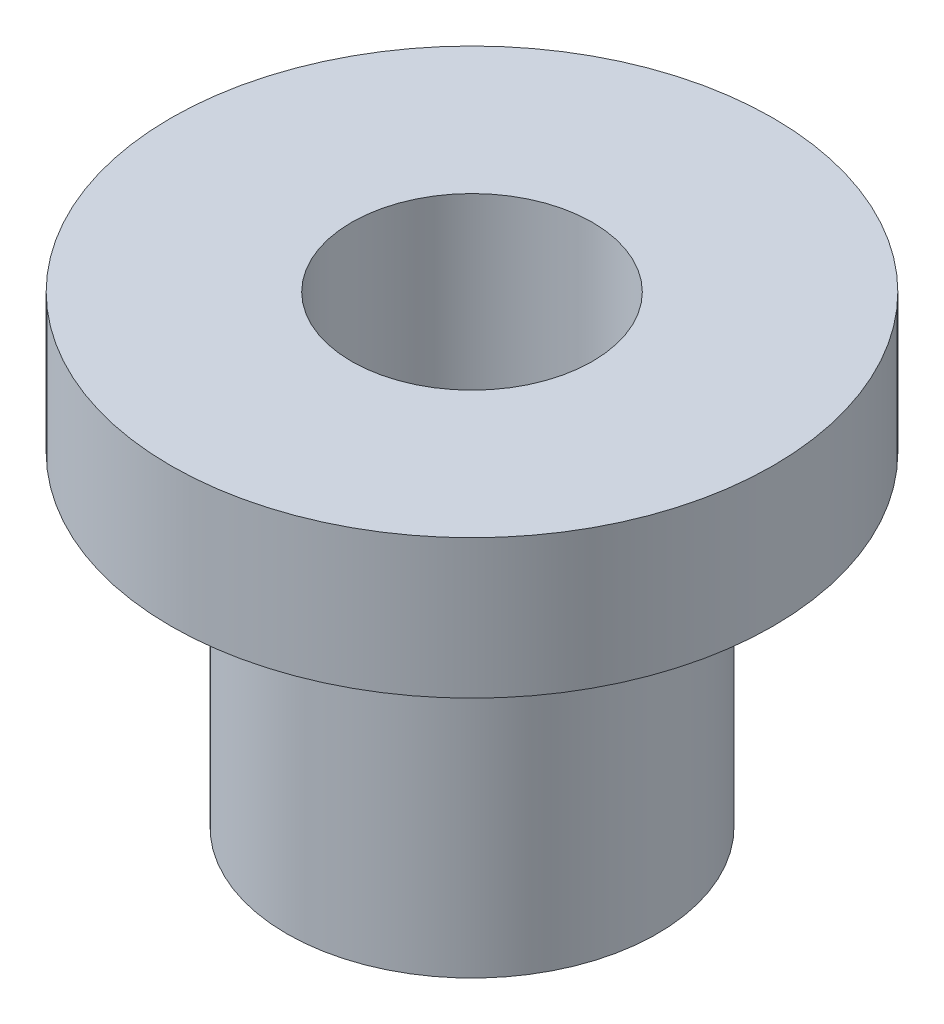
ISO-10303-21;
HEADER;
FILE_DESCRIPTION(('STEP AP214'),'2;1');
FILE_NAME('part.step','',(''),(''),'','','');
FILE_SCHEMA(('AUTOMOTIVE_DESIGN { 1 0 10303 214 1 1 1 1 }'));
ENDSEC;
DATA;
#1=APPLICATION_CONTEXT('core data for automotive mechanical design processes');
#2=APPLICATION_PROTOCOL_DEFINITION('international standard','automotive_design',2000,#1);
#3=PRODUCT_CONTEXT('',#1,'mechanical');
#4=PRODUCT('Part','Part','',(#3));
#5=PRODUCT_RELATED_PRODUCT_CATEGORY('part','',(#4));
#6=PRODUCT_DEFINITION_FORMATION('','',#4);
#7=PRODUCT_DEFINITION_CONTEXT('part definition',#1,'design');
#8=PRODUCT_DEFINITION('design','',#6,#7);
#9=PRODUCT_DEFINITION_SHAPE('','',#8);
#10=(LENGTH_UNIT() NAMED_UNIT(*) SI_UNIT(.MILLI.,.METRE.));
#11=(NAMED_UNIT(*) PLANE_ANGLE_UNIT() SI_UNIT($,.RADIAN.));
#12=(NAMED_UNIT(*) SI_UNIT($,.STERADIAN.) SOLID_ANGLE_UNIT());
#13=UNCERTAINTY_MEASURE_WITH_UNIT(LENGTH_MEASURE(1.E-05),#10,'distance_accuracy_value','');
#14=(GEOMETRIC_REPRESENTATION_CONTEXT(3) GLOBAL_UNCERTAINTY_ASSIGNED_CONTEXT((#13)) GLOBAL_UNIT_ASSIGNED_CONTEXT((#10,
#11,#12)) REPRESENTATION_CONTEXT('',''));
#15=CARTESIAN_POINT('',(0.,0.,0.));
#16=DIRECTION('',(0.,0.,1.));
#17=DIRECTION('',(1.,0.,0.));
#18=AXIS2_PLACEMENT_3D('',#15,#16,#17);
#19=CARTESIAN_POINT('',(0.,0.,0.));
#20=DIRECTION('',(0.,1.,0.));
#21=DIRECTION('',(0.,0.,1.));
#22=AXIS2_PLACEMENT_3D('',#19,#20,#21);
#23=PLANE('',#22);
#24=CARTESIAN_POINT('',(0.,0.,0.));
#25=DIRECTION('',(0.,1.,0.));
#26=DIRECTION('',(0.,0.,1.));
#27=AXIS2_PLACEMENT_3D('',#24,#25,#26);
#28=CIRCLE('',#27,4.);
#29=CARTESIAN_POINT('',(0.,0.,4.));
#30=VERTEX_POINT('',#29);
#31=EDGE_CURVE('E34',#30,#30,#28,.T.);
#32=ORIENTED_EDGE('',*,*,#31,.F.);
#33=EDGE_LOOP('',(#32));
#34=FACE_BOUND('',#33,.T.);
#35=CARTESIAN_POINT('',(0.,0.,0.));
#36=DIRECTION('',(0.,1.,0.));
#37=DIRECTION('',(0.,0.,1.));
#38=AXIS2_PLACEMENT_3D('',#35,#36,#37);
#39=CIRCLE('',#38,2.6);
#40=CARTESIAN_POINT('',(0.,0.,2.6));
#41=VERTEX_POINT('',#40);
#42=EDGE_CURVE('E41',#41,#41,#39,.T.);
#43=ORIENTED_EDGE('',*,*,#42,.T.);
#44=EDGE_LOOP('',(#43));
#45=FACE_BOUND('',#44,.T.);
#46=ADVANCED_FACE('F30',(#34,#45),#23,.F.);
#47=CARTESIAN_POINT('',(0.,7.,0.));
#48=DIRECTION('',(0.,-1.,0.));
#49=DIRECTION('',(0.,0.,-1.));
#50=AXIS2_PLACEMENT_3D('',#47,#48,#49);
#51=CYLINDRICAL_SURFACE('',#50,4.);
#52=CARTESIAN_POINT('',(0.,7.,0.));
#53=DIRECTION('',(0.,1.,0.));
#54=DIRECTION('',(0.,0.,1.));
#55=AXIS2_PLACEMENT_3D('',#52,#53,#54);
#56=CIRCLE('',#55,4.);
#57=CARTESIAN_POINT('',(0.,7.,4.));
#58=VERTEX_POINT('',#57);
#59=EDGE_CURVE('E10',#58,#58,#56,.T.);
#60=ORIENTED_EDGE('',*,*,#59,.F.);
#61=EDGE_LOOP('',(#60));
#62=FACE_BOUND('',#61,.T.);
#63=ORIENTED_EDGE('',*,*,#31,.T.);
#64=EDGE_LOOP('',(#63));
#65=FACE_BOUND('',#64,.T.);
#66=ADVANCED_FACE('F32',(#62,#65),#51,.T.);
#67=CARTESIAN_POINT('',(0.,7.,0.));
#68=DIRECTION('',(0.,-1.,0.));
#69=DIRECTION('',(0.,0.,-1.));
#70=AXIS2_PLACEMENT_3D('',#67,#68,#69);
#71=CYLINDRICAL_SURFACE('',#70,2.6);
#72=ORIENTED_EDGE('',*,*,#42,.F.);
#73=EDGE_LOOP('',(#72));
#74=FACE_BOUND('',#73,.T.);
#75=CARTESIAN_POINT('',(0.,10.,0.));
#76=DIRECTION('',(0.,1.,0.));
#77=DIRECTION('',(0.,0.,1.));
#78=AXIS2_PLACEMENT_3D('',#75,#76,#77);
#79=CIRCLE('',#78,2.6);
#80=CARTESIAN_POINT('',(0.,10.,2.6));
#81=VERTEX_POINT('',#80);
#82=EDGE_CURVE('E49',#81,#81,#79,.T.);
#83=ORIENTED_EDGE('',*,*,#82,.T.);
#84=EDGE_LOOP('',(#83));
#85=FACE_BOUND('',#84,.T.);
#86=ADVANCED_FACE('F55',(#74,#85),#71,.F.);
#87=CARTESIAN_POINT('',(0.,10.,0.));
#88=DIRECTION('',(0.,1.,0.));
#89=DIRECTION('',(0.,0.,1.));
#90=AXIS2_PLACEMENT_3D('',#87,#88,#89);
#91=PLANE('',#90);
#92=CARTESIAN_POINT('',(0.,10.,0.));
#93=DIRECTION('',(0.,1.,0.));
#94=DIRECTION('',(0.,0.,1.));
#95=AXIS2_PLACEMENT_3D('',#92,#93,#94);
#96=CIRCLE('',#95,6.5);
#97=CARTESIAN_POINT('',(0.,10.,6.5));
#98=VERTEX_POINT('',#97);
#99=EDGE_CURVE('E45',#98,#98,#96,.T.);
#100=ORIENTED_EDGE('',*,*,#99,.T.);
#101=EDGE_LOOP('',(#100));
#102=FACE_BOUND('',#101,.T.);
#103=ORIENTED_EDGE('',*,*,#82,.F.);
#104=EDGE_LOOP('',(#103));
#105=FACE_BOUND('',#104,.T.);
#106=ADVANCED_FACE('F57',(#102,#105),#91,.T.);
#107=CARTESIAN_POINT('',(0.,7.,0.));
#108=DIRECTION('',(0.,1.,0.));
#109=DIRECTION('',(0.,0.,1.));
#110=AXIS2_PLACEMENT_3D('',#107,#108,#109);
#111=PLANE('',#110);
#112=ORIENTED_EDGE('',*,*,#59,.T.);
#113=EDGE_LOOP('',(#112));
#114=FACE_BOUND('',#113,.T.);
#115=CARTESIAN_POINT('',(0.,7.,0.));
#116=DIRECTION('',(0.,1.,0.));
#117=DIRECTION('',(0.,0.,1.));
#118=AXIS2_PLACEMENT_3D('',#115,#116,#117);
#119=CIRCLE('',#118,6.5);
#120=CARTESIAN_POINT('',(0.,7.,6.5));
#121=VERTEX_POINT('',#120);
#122=EDGE_CURVE('E46',#121,#121,#119,.T.);
#123=ORIENTED_EDGE('',*,*,#122,.F.);
#124=EDGE_LOOP('',(#123));
#125=FACE_BOUND('',#124,.T.);
#126=ADVANCED_FACE('F59',(#114,#125),#111,.F.);
#127=CARTESIAN_POINT('',(0.,10.,0.));
#128=DIRECTION('',(0.,-1.,0.));
#129=DIRECTION('',(0.,0.,-1.));
#130=AXIS2_PLACEMENT_3D('',#127,#128,#129);
#131=CYLINDRICAL_SURFACE('',#130,6.5);
#132=ORIENTED_EDGE('',*,*,#99,.F.);
#133=EDGE_LOOP('',(#132));
#134=FACE_BOUND('',#133,.T.);
#135=ORIENTED_EDGE('',*,*,#122,.T.);
#136=EDGE_LOOP('',(#135));
#137=FACE_BOUND('',#136,.T.);
#138=ADVANCED_FACE('F66',(#134,#137),#131,.T.);
#139=CLOSED_SHELL('',(#46,#66,#86,#106,#126,#138));
#140=MANIFOLD_SOLID_BREP('B2',#139);
#141=ADVANCED_BREP_SHAPE_REPRESENTATION('',(#18,#140),#14);
#142=SHAPE_DEFINITION_REPRESENTATION(#9,#141);
ENDSEC;
END-ISO-10303-21;
